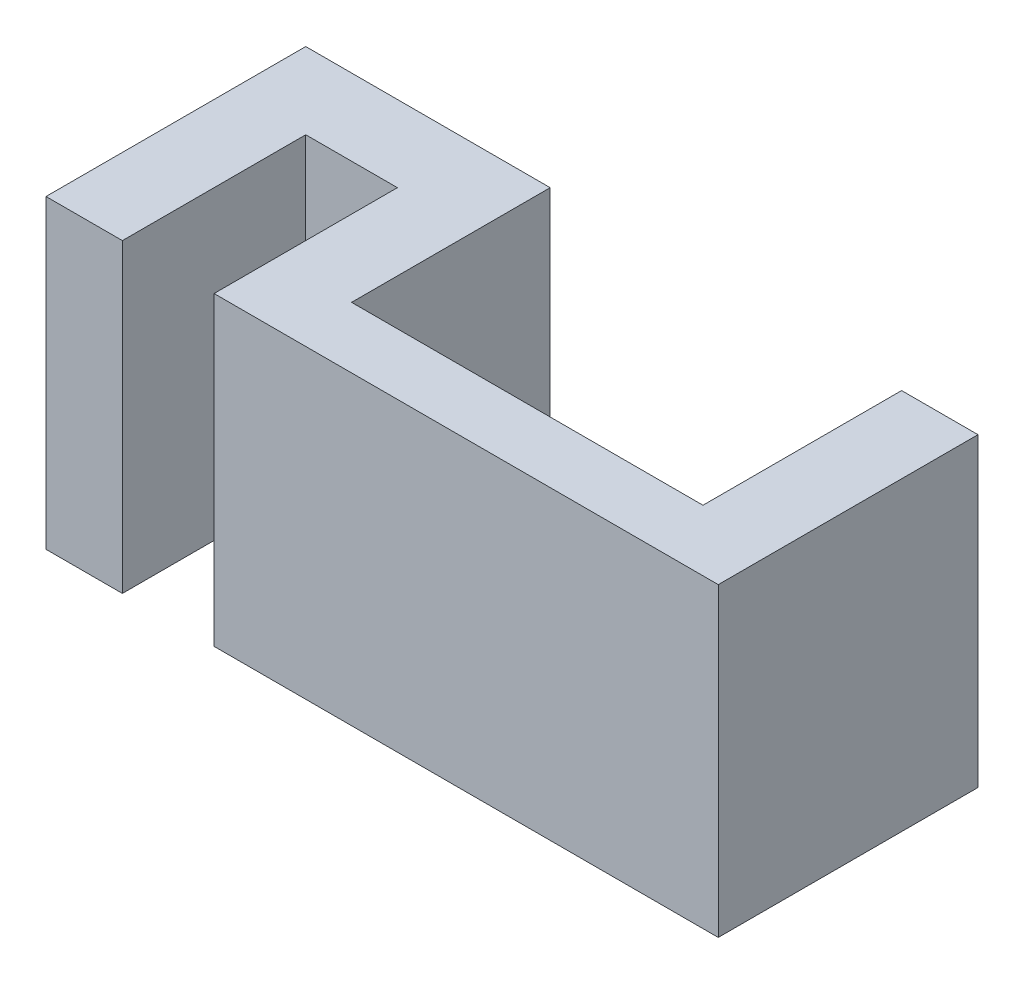
ISO-10303-21;
HEADER;
FILE_DESCRIPTION(('STEP AP214'),'2;1');
FILE_NAME('part.step','',(''),(''),'','','');
FILE_SCHEMA(('AUTOMOTIVE_DESIGN { 1 0 10303 214 1 1 1 1 }'));
ENDSEC;
DATA;
#1=APPLICATION_CONTEXT('core data for automotive mechanical design processes');
#2=APPLICATION_PROTOCOL_DEFINITION('international standard','automotive_design',2000,#1);
#3=PRODUCT_CONTEXT('',#1,'mechanical');
#4=PRODUCT('Part','Part','',(#3));
#5=PRODUCT_RELATED_PRODUCT_CATEGORY('part','',(#4));
#6=PRODUCT_DEFINITION_FORMATION('','',#4);
#7=PRODUCT_DEFINITION_CONTEXT('part definition',#1,'design');
#8=PRODUCT_DEFINITION('design','',#6,#7);
#9=PRODUCT_DEFINITION_SHAPE('','',#8);
#10=(LENGTH_UNIT() NAMED_UNIT(*) SI_UNIT(.MILLI.,.METRE.));
#11=(NAMED_UNIT(*) PLANE_ANGLE_UNIT() SI_UNIT($,.RADIAN.));
#12=(NAMED_UNIT(*) SI_UNIT($,.STERADIAN.) SOLID_ANGLE_UNIT());
#13=UNCERTAINTY_MEASURE_WITH_UNIT(LENGTH_MEASURE(1.E-05),#10,'distance_accuracy_value','');
#14=(GEOMETRIC_REPRESENTATION_CONTEXT(3) GLOBAL_UNCERTAINTY_ASSIGNED_CONTEXT((#13)) GLOBAL_UNIT_ASSIGNED_CONTEXT((#10,
#11,#12)) REPRESENTATION_CONTEXT('',''));
#15=CARTESIAN_POINT('',(0.,0.,0.));
#16=DIRECTION('',(0.,0.,1.));
#17=DIRECTION('',(1.,0.,0.));
#18=AXIS2_PLACEMENT_3D('',#15,#16,#17);
#19=CARTESIAN_POINT('',(-111.76,50.8,43.18));
#20=DIRECTION('',(0.,0.,-1.));
#21=DIRECTION('',(-1.,0.,0.));
#22=AXIS2_PLACEMENT_3D('',#19,#20,#21);
#23=PLANE('',#22);
#24=DIRECTION('',(1.,0.,0.));
#25=VECTOR('',#24,1.);
#26=CARTESIAN_POINT('',(-111.76,0.,43.18));
#27=LINE('',#26,#25);
#28=CARTESIAN_POINT('',(-111.76,0.,43.18));
#29=VERTEX_POINT('',#28);
#30=CARTESIAN_POINT('',(-99.06,0.,43.18));
#31=VERTEX_POINT('',#30);
#32=EDGE_CURVE('E153',#29,#31,#27,.T.);
#33=ORIENTED_EDGE('',*,*,#32,.T.);
#34=DIRECTION('',(0.,-1.,0.));
#35=VECTOR('',#34,1.);
#36=CARTESIAN_POINT('',(-99.06,50.8,43.18));
#37=LINE('',#36,#35);
#38=CARTESIAN_POINT('',(-99.06,50.8,43.18));
#39=VERTEX_POINT('',#38);
#40=EDGE_CURVE('E11',#39,#31,#37,.T.);
#41=ORIENTED_EDGE('',*,*,#40,.F.);
#42=DIRECTION('',(1.,0.,0.));
#43=VECTOR('',#42,1.);
#44=CARTESIAN_POINT('',(-111.76,50.8,43.18));
#45=LINE('',#44,#43);
#46=CARTESIAN_POINT('',(-111.76,50.8,43.18));
#47=VERTEX_POINT('',#46);
#48=EDGE_CURVE('E175',#47,#39,#45,.T.);
#49=ORIENTED_EDGE('',*,*,#48,.F.);
#50=DIRECTION('',(0.,-1.,0.));
#51=VECTOR('',#50,1.);
#52=CARTESIAN_POINT('',(-111.76,50.8,43.18));
#53=LINE('',#52,#51);
#54=EDGE_CURVE('E149',#47,#29,#53,.T.);
#55=ORIENTED_EDGE('',*,*,#54,.T.);
#56=EDGE_LOOP('',(#33,#41,#49,#55));
#57=FACE_BOUND('',#56,.T.);
#58=ADVANCED_FACE('F33',(#57),#23,.F.);
#59=CARTESIAN_POINT('',(-99.06,50.8,43.18));
#60=DIRECTION('',(-1.,0.,0.));
#61=DIRECTION('',(0.,0.,1.));
#62=AXIS2_PLACEMENT_3D('',#59,#60,#61);
#63=PLANE('',#62);
#64=DIRECTION('',(0.,0.,-1.));
#65=VECTOR('',#64,1.);
#66=CARTESIAN_POINT('',(-99.06,0.,43.18));
#67=LINE('',#66,#65);
#68=CARTESIAN_POINT('',(-99.06,0.,12.7));
#69=VERTEX_POINT('',#68);
#70=EDGE_CURVE('E156',#31,#69,#67,.T.);
#71=ORIENTED_EDGE('',*,*,#70,.T.);
#72=DIRECTION('',(0.,-1.,0.));
#73=VECTOR('',#72,1.);
#74=CARTESIAN_POINT('',(-99.06,50.8,12.7));
#75=LINE('',#74,#73);
#76=CARTESIAN_POINT('',(-99.06,50.8,12.7));
#77=VERTEX_POINT('',#76);
#78=EDGE_CURVE('E41',#77,#69,#75,.T.);
#79=ORIENTED_EDGE('',*,*,#78,.F.);
#80=DIRECTION('',(0.,0.,-1.));
#81=VECTOR('',#80,1.);
#82=CARTESIAN_POINT('',(-99.06,50.8,43.18));
#83=LINE('',#82,#81);
#84=EDGE_CURVE('E104',#39,#77,#83,.T.);
#85=ORIENTED_EDGE('',*,*,#84,.F.);
#86=ORIENTED_EDGE('',*,*,#40,.T.);
#87=EDGE_LOOP('',(#71,#79,#85,#86));
#88=FACE_BOUND('',#87,.T.);
#89=ADVANCED_FACE('F253',(#88),#63,.F.);
#90=CARTESIAN_POINT('',(-99.06,50.8,12.7));
#91=DIRECTION('',(0.,0.,-1.));
#92=DIRECTION('',(-1.,0.,0.));
#93=AXIS2_PLACEMENT_3D('',#90,#91,#92);
#94=PLANE('',#93);
#95=DIRECTION('',(1.,0.,0.));
#96=VECTOR('',#95,1.);
#97=CARTESIAN_POINT('',(-99.06,0.,12.7));
#98=LINE('',#97,#96);
#99=CARTESIAN_POINT('',(-83.82,0.,12.7));
#100=VERTEX_POINT('',#99);
#101=EDGE_CURVE('E158',#69,#100,#98,.T.);
#102=ORIENTED_EDGE('',*,*,#101,.T.);
#103=DIRECTION('',(0.,-1.,0.));
#104=VECTOR('',#103,1.);
#105=CARTESIAN_POINT('',(-83.82,50.8,12.7));
#106=LINE('',#105,#104);
#107=CARTESIAN_POINT('',(-83.82,50.8,12.7));
#108=VERTEX_POINT('',#107);
#109=EDGE_CURVE('E194',#108,#100,#106,.T.);
#110=ORIENTED_EDGE('',*,*,#109,.F.);
#111=DIRECTION('',(1.,0.,0.));
#112=VECTOR('',#111,1.);
#113=CARTESIAN_POINT('',(-99.06,50.8,12.7));
#114=LINE('',#113,#112);
#115=EDGE_CURVE('E202',#77,#108,#114,.T.);
#116=ORIENTED_EDGE('',*,*,#115,.F.);
#117=ORIENTED_EDGE('',*,*,#78,.T.);
#118=EDGE_LOOP('',(#102,#110,#116,#117));
#119=FACE_BOUND('',#118,.T.);
#120=ADVANCED_FACE('F200',(#119),#94,.F.);
#121=CARTESIAN_POINT('',(-83.82,50.8,12.7));
#122=DIRECTION('',(1.,0.,0.));
#123=DIRECTION('',(0.,0.,-1.));
#124=AXIS2_PLACEMENT_3D('',#121,#122,#123);
#125=PLANE('',#124);
#126=DIRECTION('',(0.,0.,1.));
#127=VECTOR('',#126,1.);
#128=CARTESIAN_POINT('',(-83.82,0.,12.7));
#129=LINE('',#128,#127);
#130=CARTESIAN_POINT('',(-83.82,0.,43.18));
#131=VERTEX_POINT('',#130);
#132=EDGE_CURVE('E160',#100,#131,#129,.T.);
#133=ORIENTED_EDGE('',*,*,#132,.T.);
#134=DIRECTION('',(0.,-1.,0.));
#135=VECTOR('',#134,1.);
#136=CARTESIAN_POINT('',(-83.82,50.8,43.18));
#137=LINE('',#136,#135);
#138=CARTESIAN_POINT('',(-83.82,50.8,43.18));
#139=VERTEX_POINT('',#138);
#140=EDGE_CURVE('E191',#139,#131,#137,.T.);
#141=ORIENTED_EDGE('',*,*,#140,.F.);
#142=DIRECTION('',(0.,0.,1.));
#143=VECTOR('',#142,1.);
#144=CARTESIAN_POINT('',(-83.82,50.8,12.7));
#145=LINE('',#144,#143);
#146=EDGE_CURVE('E220',#108,#139,#145,.T.);
#147=ORIENTED_EDGE('',*,*,#146,.F.);
#148=ORIENTED_EDGE('',*,*,#109,.T.);
#149=EDGE_LOOP('',(#133,#141,#147,#148));
#150=FACE_BOUND('',#149,.T.);
#151=ADVANCED_FACE('F211',(#150),#125,.F.);
#152=CARTESIAN_POINT('',(-83.82,50.8,43.18));
#153=DIRECTION('',(0.,0.,-1.));
#154=DIRECTION('',(-1.,0.,0.));
#155=AXIS2_PLACEMENT_3D('',#152,#153,#154);
#156=PLANE('',#155);
#157=DIRECTION('',(1.,0.,0.));
#158=VECTOR('',#157,1.);
#159=CARTESIAN_POINT('',(-83.82,0.,43.18));
#160=LINE('',#159,#158);
#161=CARTESIAN_POINT('',(0.,0.,43.18));
#162=VERTEX_POINT('',#161);
#163=EDGE_CURVE('E162',#131,#162,#160,.T.);
#164=ORIENTED_EDGE('',*,*,#163,.T.);
#165=DIRECTION('',(0.,-1.,0.));
#166=VECTOR('',#165,1.);
#167=CARTESIAN_POINT('',(0.,50.8,43.18));
#168=LINE('',#167,#166);
#169=CARTESIAN_POINT('',(0.,50.8,43.18));
#170=VERTEX_POINT('',#169);
#171=EDGE_CURVE('E188',#170,#162,#168,.T.);
#172=ORIENTED_EDGE('',*,*,#171,.F.);
#173=DIRECTION('',(1.,0.,0.));
#174=VECTOR('',#173,1.);
#175=CARTESIAN_POINT('',(-83.82,50.8,43.18));
#176=LINE('',#175,#174);
#177=EDGE_CURVE('E217',#139,#170,#176,.T.);
#178=ORIENTED_EDGE('',*,*,#177,.F.);
#179=ORIENTED_EDGE('',*,*,#140,.T.);
#180=EDGE_LOOP('',(#164,#172,#178,#179));
#181=FACE_BOUND('',#180,.T.);
#182=ADVANCED_FACE('F215',(#181),#156,.F.);
#183=CARTESIAN_POINT('',(0.,50.8,43.18));
#184=DIRECTION('',(-1.,0.,0.));
#185=DIRECTION('',(0.,0.,1.));
#186=AXIS2_PLACEMENT_3D('',#183,#184,#185);
#187=PLANE('',#186);
#188=DIRECTION('',(0.,0.,-1.));
#189=VECTOR('',#188,1.);
#190=CARTESIAN_POINT('',(0.,0.,43.18));
#191=LINE('',#190,#189);
#192=CARTESIAN_POINT('',(0.,0.,0.));
#193=VERTEX_POINT('',#192);
#194=EDGE_CURVE('E164',#162,#193,#191,.T.);
#195=ORIENTED_EDGE('',*,*,#194,.T.);
#196=DIRECTION('',(0.,-1.,0.));
#197=VECTOR('',#196,1.);
#198=CARTESIAN_POINT('',(0.,50.8,0.));
#199=LINE('',#198,#197);
#200=CARTESIAN_POINT('',(0.,50.8,0.));
#201=VERTEX_POINT('',#200);
#202=EDGE_CURVE('E185',#201,#193,#199,.T.);
#203=ORIENTED_EDGE('',*,*,#202,.F.);
#204=DIRECTION('',(0.,0.,-1.));
#205=VECTOR('',#204,1.);
#206=CARTESIAN_POINT('',(0.,50.8,43.18));
#207=LINE('',#206,#205);
#208=EDGE_CURVE('E219',#170,#201,#207,.T.);
#209=ORIENTED_EDGE('',*,*,#208,.F.);
#210=ORIENTED_EDGE('',*,*,#171,.T.);
#211=EDGE_LOOP('',(#195,#203,#209,#210));
#212=FACE_BOUND('',#211,.T.);
#213=ADVANCED_FACE('F266',(#212),#187,.F.);
#214=CARTESIAN_POINT('',(0.,50.8,0.));
#215=DIRECTION('',(0.,0.,1.));
#216=DIRECTION('',(1.,0.,0.));
#217=AXIS2_PLACEMENT_3D('',#214,#215,#216);
#218=PLANE('',#217);
#219=DIRECTION('',(-1.,0.,0.));
#220=VECTOR('',#219,1.);
#221=CARTESIAN_POINT('',(0.,0.,0.));
#222=LINE('',#221,#220);
#223=CARTESIAN_POINT('',(-12.7,0.,0.));
#224=VERTEX_POINT('',#223);
#225=EDGE_CURVE('E166',#193,#224,#222,.T.);
#226=ORIENTED_EDGE('',*,*,#225,.T.);
#227=DIRECTION('',(0.,-1.,0.));
#228=VECTOR('',#227,1.);
#229=CARTESIAN_POINT('',(-12.7,50.8,0.));
#230=LINE('',#229,#228);
#231=CARTESIAN_POINT('',(-12.7,50.8,0.));
#232=VERTEX_POINT('',#231);
#233=EDGE_CURVE('E182',#232,#224,#230,.T.);
#234=ORIENTED_EDGE('',*,*,#233,.F.);
#235=DIRECTION('',(-1.,0.,0.));
#236=VECTOR('',#235,1.);
#237=CARTESIAN_POINT('',(0.,50.8,0.));
#238=LINE('',#237,#236);
#239=EDGE_CURVE('E222',#201,#232,#238,.T.);
#240=ORIENTED_EDGE('',*,*,#239,.F.);
#241=ORIENTED_EDGE('',*,*,#202,.T.);
#242=EDGE_LOOP('',(#226,#234,#240,#241));
#243=FACE_BOUND('',#242,.T.);
#244=ADVANCED_FACE('F269',(#243),#218,.F.);
#245=CARTESIAN_POINT('',(-12.7,50.8,0.));
#246=DIRECTION('',(1.,0.,0.));
#247=DIRECTION('',(0.,0.,-1.));
#248=AXIS2_PLACEMENT_3D('',#245,#246,#247);
#249=PLANE('',#248);
#250=DIRECTION('',(0.,0.,1.));
#251=VECTOR('',#250,1.);
#252=CARTESIAN_POINT('',(-12.7,0.,0.));
#253=LINE('',#252,#251);
#254=CARTESIAN_POINT('',(-12.7,0.,33.02));
#255=VERTEX_POINT('',#254);
#256=EDGE_CURVE('E168',#224,#255,#253,.T.);
#257=ORIENTED_EDGE('',*,*,#256,.T.);
#258=DIRECTION('',(0.,-1.,0.));
#259=VECTOR('',#258,1.);
#260=CARTESIAN_POINT('',(-12.7,50.8,33.02));
#261=LINE('',#260,#259);
#262=CARTESIAN_POINT('',(-12.7,50.8,33.02));
#263=VERTEX_POINT('',#262);
#264=EDGE_CURVE('E179',#263,#255,#261,.T.);
#265=ORIENTED_EDGE('',*,*,#264,.F.);
#266=DIRECTION('',(0.,0.,1.));
#267=VECTOR('',#266,1.);
#268=CARTESIAN_POINT('',(-12.7,50.8,0.));
#269=LINE('',#268,#267);
#270=EDGE_CURVE('E228',#232,#263,#269,.T.);
#271=ORIENTED_EDGE('',*,*,#270,.F.);
#272=ORIENTED_EDGE('',*,*,#233,.T.);
#273=EDGE_LOOP('',(#257,#265,#271,#272));
#274=FACE_BOUND('',#273,.T.);
#275=ADVANCED_FACE('F234',(#274),#249,.F.);
#276=CARTESIAN_POINT('',(-12.7,50.8,33.02));
#277=DIRECTION('',(0.,0.,1.));
#278=DIRECTION('',(1.,0.,0.));
#279=AXIS2_PLACEMENT_3D('',#276,#277,#278);
#280=PLANE('',#279);
#281=DIRECTION('',(-1.,0.,0.));
#282=VECTOR('',#281,1.);
#283=CARTESIAN_POINT('',(-12.7,0.,33.02));
#284=LINE('',#283,#282);
#285=CARTESIAN_POINT('',(-71.12,0.,33.02));
#286=VERTEX_POINT('',#285);
#287=EDGE_CURVE('E170',#255,#286,#284,.T.);
#288=ORIENTED_EDGE('',*,*,#287,.T.);
#289=DIRECTION('',(0.,-1.,0.));
#290=VECTOR('',#289,1.);
#291=CARTESIAN_POINT('',(-71.12,50.8,33.02));
#292=LINE('',#291,#290);
#293=CARTESIAN_POINT('',(-71.12,50.8,33.02));
#294=VERTEX_POINT('',#293);
#295=EDGE_CURVE('E144',#294,#286,#292,.T.);
#296=ORIENTED_EDGE('',*,*,#295,.F.);
#297=DIRECTION('',(-1.,0.,0.));
#298=VECTOR('',#297,1.);
#299=CARTESIAN_POINT('',(-12.7,50.8,33.02));
#300=LINE('',#299,#298);
#301=EDGE_CURVE('E135',#263,#294,#300,.T.);
#302=ORIENTED_EDGE('',*,*,#301,.F.);
#303=ORIENTED_EDGE('',*,*,#264,.T.);
#304=EDGE_LOOP('',(#288,#296,#302,#303));
#305=FACE_BOUND('',#304,.T.);
#306=ADVANCED_FACE('F238',(#305),#280,.F.);
#307=CARTESIAN_POINT('',(-71.12,50.8,33.02));
#308=DIRECTION('',(-1.,0.,0.));
#309=DIRECTION('',(0.,0.,1.));
#310=AXIS2_PLACEMENT_3D('',#307,#308,#309);
#311=PLANE('',#310);
#312=DIRECTION('',(0.,0.,-1.));
#313=VECTOR('',#312,1.);
#314=CARTESIAN_POINT('',(-71.12,0.,33.02));
#315=LINE('',#314,#313);
#316=CARTESIAN_POINT('',(-71.12,0.,0.));
#317=VERTEX_POINT('',#316);
#318=EDGE_CURVE('E143',#286,#317,#315,.T.);
#319=ORIENTED_EDGE('',*,*,#318,.T.);
#320=DIRECTION('',(0.,-1.,0.));
#321=VECTOR('',#320,1.);
#322=CARTESIAN_POINT('',(-71.12,50.8,0.));
#323=LINE('',#322,#321);
#324=CARTESIAN_POINT('',(-71.12,50.8,0.));
#325=VERTEX_POINT('',#324);
#326=EDGE_CURVE('E140',#325,#317,#323,.T.);
#327=ORIENTED_EDGE('',*,*,#326,.F.);
#328=DIRECTION('',(0.,0.,-1.));
#329=VECTOR('',#328,1.);
#330=CARTESIAN_POINT('',(-71.12,50.8,33.02));
#331=LINE('',#330,#329);
#332=EDGE_CURVE('E129',#294,#325,#331,.T.);
#333=ORIENTED_EDGE('',*,*,#332,.F.);
#334=ORIENTED_EDGE('',*,*,#295,.T.);
#335=EDGE_LOOP('',(#319,#327,#333,#334));
#336=FACE_BOUND('',#335,.T.);
#337=ADVANCED_FACE('F141',(#336),#311,.F.);
#338=CARTESIAN_POINT('',(-71.12,50.8,0.));
#339=DIRECTION('',(0.,0.,1.));
#340=DIRECTION('',(1.,0.,0.));
#341=AXIS2_PLACEMENT_3D('',#338,#339,#340);
#342=PLANE('',#341);
#343=DIRECTION('',(-1.,0.,0.));
#344=VECTOR('',#343,1.);
#345=CARTESIAN_POINT('',(-71.12,0.,0.));
#346=LINE('',#345,#344);
#347=CARTESIAN_POINT('',(-111.76,0.,0.));
#348=VERTEX_POINT('',#347);
#349=EDGE_CURVE('E90',#317,#348,#346,.T.);
#350=ORIENTED_EDGE('',*,*,#349,.T.);
#351=DIRECTION('',(0.,-1.,0.));
#352=VECTOR('',#351,1.);
#353=CARTESIAN_POINT('',(-111.76,50.8,0.));
#354=LINE('',#353,#352);
#355=CARTESIAN_POINT('',(-111.76,50.8,0.));
#356=VERTEX_POINT('',#355);
#357=EDGE_CURVE('E145',#356,#348,#354,.T.);
#358=ORIENTED_EDGE('',*,*,#357,.F.);
#359=DIRECTION('',(-1.,0.,0.));
#360=VECTOR('',#359,1.);
#361=CARTESIAN_POINT('',(-71.12,50.8,0.));
#362=LINE('',#361,#360);
#363=EDGE_CURVE('E133',#325,#356,#362,.T.);
#364=ORIENTED_EDGE('',*,*,#363,.F.);
#365=ORIENTED_EDGE('',*,*,#326,.T.);
#366=EDGE_LOOP('',(#350,#358,#364,#365));
#367=FACE_BOUND('',#366,.T.);
#368=ADVANCED_FACE('F147',(#367),#342,.F.);
#369=CARTESIAN_POINT('',(-111.76,50.8,0.));
#370=DIRECTION('',(1.,0.,0.));
#371=DIRECTION('',(0.,0.,-1.));
#372=AXIS2_PLACEMENT_3D('',#369,#370,#371);
#373=PLANE('',#372);
#374=DIRECTION('',(0.,0.,1.));
#375=VECTOR('',#374,1.);
#376=CARTESIAN_POINT('',(-111.76,0.,0.));
#377=LINE('',#376,#375);
#378=EDGE_CURVE('E96',#348,#29,#377,.T.);
#379=ORIENTED_EDGE('',*,*,#378,.T.);
#380=ORIENTED_EDGE('',*,*,#54,.F.);
#381=DIRECTION('',(0.,0.,1.));
#382=VECTOR('',#381,1.);
#383=CARTESIAN_POINT('',(-111.76,50.8,0.));
#384=LINE('',#383,#382);
#385=EDGE_CURVE('E49',#356,#47,#384,.T.);
#386=ORIENTED_EDGE('',*,*,#385,.F.);
#387=ORIENTED_EDGE('',*,*,#357,.T.);
#388=EDGE_LOOP('',(#379,#380,#386,#387));
#389=FACE_BOUND('',#388,.T.);
#390=ADVANCED_FACE('F242',(#389),#373,.F.);
#391=CARTESIAN_POINT('',(0.,50.8,0.));
#392=DIRECTION('',(0.,1.,0.));
#393=DIRECTION('',(0.,0.,1.));
#394=AXIS2_PLACEMENT_3D('',#391,#392,#393);
#395=PLANE('',#394);
#396=ORIENTED_EDGE('',*,*,#48,.T.);
#397=ORIENTED_EDGE('',*,*,#84,.T.);
#398=ORIENTED_EDGE('',*,*,#115,.T.);
#399=ORIENTED_EDGE('',*,*,#146,.T.);
#400=ORIENTED_EDGE('',*,*,#177,.T.);
#401=ORIENTED_EDGE('',*,*,#208,.T.);
#402=ORIENTED_EDGE('',*,*,#239,.T.);
#403=ORIENTED_EDGE('',*,*,#270,.T.);
#404=ORIENTED_EDGE('',*,*,#301,.T.);
#405=ORIENTED_EDGE('',*,*,#332,.T.);
#406=ORIENTED_EDGE('',*,*,#363,.T.);
#407=ORIENTED_EDGE('',*,*,#385,.T.);
#408=EDGE_LOOP('',(#396,#397,#398,#399,#400,#401,#402,#403,#404,#405,#406,#407));
#409=FACE_BOUND('',#408,.T.);
#410=ADVANCED_FACE('F131',(#409),#395,.T.);
#411=CARTESIAN_POINT('',(0.,0.,0.));
#412=DIRECTION('',(0.,1.,0.));
#413=DIRECTION('',(0.,0.,1.));
#414=AXIS2_PLACEMENT_3D('',#411,#412,#413);
#415=PLANE('',#414);
#416=ORIENTED_EDGE('',*,*,#32,.F.);
#417=ORIENTED_EDGE('',*,*,#378,.F.);
#418=ORIENTED_EDGE('',*,*,#349,.F.);
#419=ORIENTED_EDGE('',*,*,#318,.F.);
#420=ORIENTED_EDGE('',*,*,#287,.F.);
#421=ORIENTED_EDGE('',*,*,#256,.F.);
#422=ORIENTED_EDGE('',*,*,#225,.F.);
#423=ORIENTED_EDGE('',*,*,#194,.F.);
#424=ORIENTED_EDGE('',*,*,#163,.F.);
#425=ORIENTED_EDGE('',*,*,#132,.F.);
#426=ORIENTED_EDGE('',*,*,#101,.F.);
#427=ORIENTED_EDGE('',*,*,#70,.F.);
#428=EDGE_LOOP('',(#416,#417,#418,#419,#420,#421,#422,#423,#424,#425,#426,#427));
#429=FACE_BOUND('',#428,.T.);
#430=ADVANCED_FACE('F206',(#429),#415,.F.);
#431=CLOSED_SHELL('',(#58,#89,#120,#151,#182,#213,#244,#275,#306,#337,#368,#390,#410,#430));
#432=MANIFOLD_SOLID_BREP('B2',#431);
#433=ADVANCED_BREP_SHAPE_REPRESENTATION('',(#18,#432),#14);
#434=SHAPE_DEFINITION_REPRESENTATION(#9,#433);
ENDSEC;
END-ISO-10303-21;
